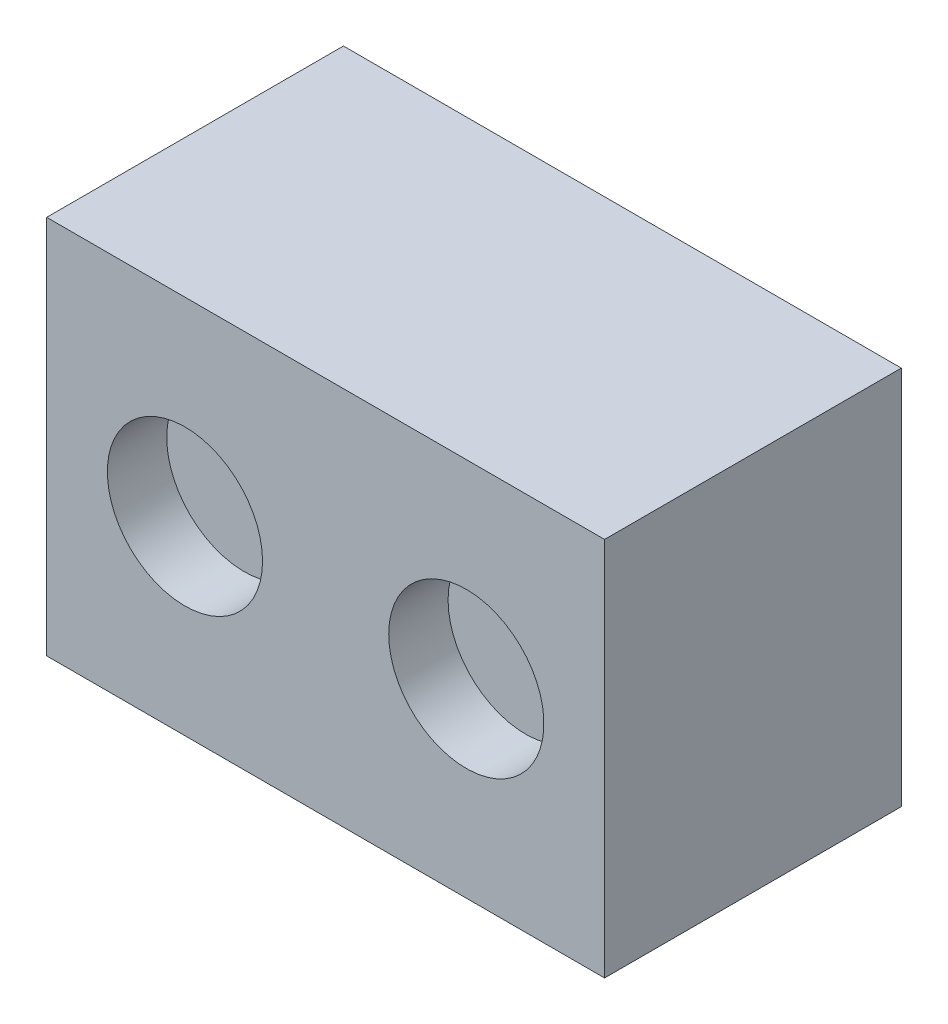
ISO-10303-21;
HEADER;
FILE_DESCRIPTION(('STEP AP214'),'2;1');
FILE_NAME('part.step','',(''),(''),'','','');
FILE_SCHEMA(('AUTOMOTIVE_DESIGN { 1 0 10303 214 1 1 1 1 }'));
ENDSEC;
DATA;
#1=APPLICATION_CONTEXT('core data for automotive mechanical design processes');
#2=APPLICATION_PROTOCOL_DEFINITION('international standard','automotive_design',2000,#1);
#3=PRODUCT_CONTEXT('',#1,'mechanical');
#4=PRODUCT('Part','Part','',(#3));
#5=PRODUCT_RELATED_PRODUCT_CATEGORY('part','',(#4));
#6=PRODUCT_DEFINITION_FORMATION('','',#4);
#7=PRODUCT_DEFINITION_CONTEXT('part definition',#1,'design');
#8=PRODUCT_DEFINITION('design','',#6,#7);
#9=PRODUCT_DEFINITION_SHAPE('','',#8);
#10=(LENGTH_UNIT() NAMED_UNIT(*) SI_UNIT(.MILLI.,.METRE.));
#11=(NAMED_UNIT(*) PLANE_ANGLE_UNIT() SI_UNIT($,.RADIAN.));
#12=(NAMED_UNIT(*) SI_UNIT($,.STERADIAN.) SOLID_ANGLE_UNIT());
#13=UNCERTAINTY_MEASURE_WITH_UNIT(LENGTH_MEASURE(1.E-05),#10,'distance_accuracy_value','');
#14=(GEOMETRIC_REPRESENTATION_CONTEXT(3) GLOBAL_UNCERTAINTY_ASSIGNED_CONTEXT((#13)) GLOBAL_UNIT_ASSIGNED_CONTEXT((#10,
#11,#12)) REPRESENTATION_CONTEXT('',''));
#15=CARTESIAN_POINT('',(0.,0.,0.));
#16=DIRECTION('',(0.,0.,1.));
#17=DIRECTION('',(1.,0.,0.));
#18=AXIS2_PLACEMENT_3D('',#15,#16,#17);
#19=CARTESIAN_POINT('',(9.4,6.4,10.));
#20=DIRECTION('',(-1.,0.,0.));
#21=DIRECTION('',(0.,0.,1.));
#22=AXIS2_PLACEMENT_3D('',#19,#20,#21);
#23=PLANE('',#22);
#24=DIRECTION('',(0.,1.,0.));
#25=VECTOR('',#24,1.);
#26=CARTESIAN_POINT('',(9.4,6.4,0.));
#27=LINE('',#26,#25);
#28=CARTESIAN_POINT('',(9.4,-6.4,0.));
#29=VERTEX_POINT('',#28);
#30=CARTESIAN_POINT('',(9.4,6.4,0.));
#31=VERTEX_POINT('',#30);
#32=EDGE_CURVE('E113',#29,#31,#27,.T.);
#33=ORIENTED_EDGE('',*,*,#32,.T.);
#34=DIRECTION('',(0.,0.,-1.));
#35=VECTOR('',#34,1.);
#36=CARTESIAN_POINT('',(9.4,6.4,10.));
#37=LINE('',#36,#35);
#38=CARTESIAN_POINT('',(9.4,6.4,10.));
#39=VERTEX_POINT('',#38);
#40=EDGE_CURVE('E11',#39,#31,#37,.T.);
#41=ORIENTED_EDGE('',*,*,#40,.F.);
#42=DIRECTION('',(0.,1.,0.));
#43=VECTOR('',#42,1.);
#44=CARTESIAN_POINT('',(9.4,6.4,10.));
#45=LINE('',#44,#43);
#46=CARTESIAN_POINT('',(9.4,-6.4,10.));
#47=VERTEX_POINT('',#46);
#48=EDGE_CURVE('E97',#47,#39,#45,.T.);
#49=ORIENTED_EDGE('',*,*,#48,.F.);
#50=DIRECTION('',(0.,0.,-1.));
#51=VECTOR('',#50,1.);
#52=CARTESIAN_POINT('',(9.4,-6.4,10.));
#53=LINE('',#52,#51);
#54=EDGE_CURVE('E109',#47,#29,#53,.T.);
#55=ORIENTED_EDGE('',*,*,#54,.T.);
#56=EDGE_LOOP('',(#33,#41,#49,#55));
#57=FACE_BOUND('',#56,.T.);
#58=ADVANCED_FACE('F45',(#57),#23,.F.);
#59=CARTESIAN_POINT('',(-9.4,6.4,10.));
#60=DIRECTION('',(0.,-1.,0.));
#61=DIRECTION('',(0.,0.,-1.));
#62=AXIS2_PLACEMENT_3D('',#59,#60,#61);
#63=PLANE('',#62);
#64=DIRECTION('',(-1.,0.,0.));
#65=VECTOR('',#64,1.);
#66=CARTESIAN_POINT('',(-9.4,6.4,0.));
#67=LINE('',#66,#65);
#68=CARTESIAN_POINT('',(-9.4,6.4,0.));
#69=VERTEX_POINT('',#68);
#70=EDGE_CURVE('E102',#31,#69,#67,.T.);
#71=ORIENTED_EDGE('',*,*,#70,.T.);
#72=DIRECTION('',(0.,0.,-1.));
#73=VECTOR('',#72,1.);
#74=CARTESIAN_POINT('',(-9.4,6.4,10.));
#75=LINE('',#74,#73);
#76=CARTESIAN_POINT('',(-9.4,6.4,10.));
#77=VERTEX_POINT('',#76);
#78=EDGE_CURVE('E54',#77,#69,#75,.T.);
#79=ORIENTED_EDGE('',*,*,#78,.F.);
#80=DIRECTION('',(-1.,0.,0.));
#81=VECTOR('',#80,1.);
#82=CARTESIAN_POINT('',(-9.4,6.4,10.));
#83=LINE('',#82,#81);
#84=EDGE_CURVE('E92',#39,#77,#83,.T.);
#85=ORIENTED_EDGE('',*,*,#84,.F.);
#86=ORIENTED_EDGE('',*,*,#40,.T.);
#87=EDGE_LOOP('',(#71,#79,#85,#86));
#88=FACE_BOUND('',#87,.T.);
#89=ADVANCED_FACE('F101',(#88),#63,.F.);
#90=CARTESIAN_POINT('',(-9.4,6.4,10.));
#91=DIRECTION('',(1.,0.,0.));
#92=DIRECTION('',(0.,0.,-1.));
#93=AXIS2_PLACEMENT_3D('',#90,#91,#92);
#94=PLANE('',#93);
#95=DIRECTION('',(0.,-1.,0.));
#96=VECTOR('',#95,1.);
#97=CARTESIAN_POINT('',(-9.4,6.4,0.));
#98=LINE('',#97,#96);
#99=CARTESIAN_POINT('',(-9.4,-6.4,0.));
#100=VERTEX_POINT('',#99);
#101=EDGE_CURVE('E79',#69,#100,#98,.T.);
#102=ORIENTED_EDGE('',*,*,#101,.T.);
#103=DIRECTION('',(0.,0.,-1.));
#104=VECTOR('',#103,1.);
#105=CARTESIAN_POINT('',(-9.4,-6.4,10.));
#106=LINE('',#105,#104);
#107=CARTESIAN_POINT('',(-9.4,-6.4,10.));
#108=VERTEX_POINT('',#107);
#109=EDGE_CURVE('E104',#108,#100,#106,.T.);
#110=ORIENTED_EDGE('',*,*,#109,.F.);
#111=DIRECTION('',(0.,-1.,0.));
#112=VECTOR('',#111,1.);
#113=CARTESIAN_POINT('',(-9.4,6.4,10.));
#114=LINE('',#113,#112);
#115=EDGE_CURVE('E95',#77,#108,#114,.T.);
#116=ORIENTED_EDGE('',*,*,#115,.F.);
#117=ORIENTED_EDGE('',*,*,#78,.T.);
#118=EDGE_LOOP('',(#102,#110,#116,#117));
#119=FACE_BOUND('',#118,.T.);
#120=ADVANCED_FACE('F105',(#119),#94,.F.);
#121=CARTESIAN_POINT('',(-9.4,-6.4,10.));
#122=DIRECTION('',(0.,1.,0.));
#123=DIRECTION('',(0.,0.,1.));
#124=AXIS2_PLACEMENT_3D('',#121,#122,#123);
#125=PLANE('',#124);
#126=DIRECTION('',(1.,0.,0.));
#127=VECTOR('',#126,1.);
#128=CARTESIAN_POINT('',(-9.4,-6.4,0.));
#129=LINE('',#128,#127);
#130=EDGE_CURVE('E85',#100,#29,#129,.T.);
#131=ORIENTED_EDGE('',*,*,#130,.T.);
#132=ORIENTED_EDGE('',*,*,#54,.F.);
#133=DIRECTION('',(1.,0.,0.));
#134=VECTOR('',#133,1.);
#135=CARTESIAN_POINT('',(-9.4,-6.4,10.));
#136=LINE('',#135,#134);
#137=EDGE_CURVE('E62',#108,#47,#136,.T.);
#138=ORIENTED_EDGE('',*,*,#137,.F.);
#139=ORIENTED_EDGE('',*,*,#109,.T.);
#140=EDGE_LOOP('',(#131,#132,#138,#139));
#141=FACE_BOUND('',#140,.T.);
#142=ADVANCED_FACE('F127',(#141),#125,.F.);
#143=CARTESIAN_POINT('',(0.,0.,10.));
#144=DIRECTION('',(0.,0.,1.));
#145=DIRECTION('',(1.,0.,0.));
#146=AXIS2_PLACEMENT_3D('',#143,#144,#145);
#147=PLANE('',#146);
#148=CARTESIAN_POINT('',(4.74066889936202,0.,10.));
#149=DIRECTION('',(0.,0.,-1.));
#150=DIRECTION('',(-1.,0.,0.));
#151=AXIS2_PLACEMENT_3D('',#148,#149,#150);
#152=CIRCLE('',#151,2.6146428966049);
#153=CARTESIAN_POINT('',(2.12602600275711,0.,10.));
#154=VERTEX_POINT('',#153);
#155=EDGE_CURVE('E142',#154,#154,#152,.T.);
#156=ORIENTED_EDGE('',*,*,#155,.T.);
#157=EDGE_LOOP('',(#156));
#158=FACE_BOUND('',#157,.T.);
#159=CARTESIAN_POINT('',(-4.74066889936202,0.,10.));
#160=DIRECTION('',(0.,0.,1.));
#161=DIRECTION('',(1.,0.,0.));
#162=AXIS2_PLACEMENT_3D('',#159,#160,#161);
#163=CIRCLE('',#162,2.6146428966049);
#164=CARTESIAN_POINT('',(-2.12602600275711,0.,10.));
#165=VERTEX_POINT('',#164);
#166=EDGE_CURVE('E134',#165,#165,#163,.T.);
#167=ORIENTED_EDGE('',*,*,#166,.F.);
#168=EDGE_LOOP('',(#167));
#169=FACE_BOUND('',#168,.T.);
#170=ORIENTED_EDGE('',*,*,#48,.T.);
#171=ORIENTED_EDGE('',*,*,#84,.T.);
#172=ORIENTED_EDGE('',*,*,#115,.T.);
#173=ORIENTED_EDGE('',*,*,#137,.T.);
#174=EDGE_LOOP('',(#170,#171,#172,#173));
#175=FACE_BOUND('',#174,.T.);
#176=ADVANCED_FACE('F93',(#158,#169,#175),#147,.T.);
#177=CARTESIAN_POINT('',(0.,0.,0.));
#178=DIRECTION('',(0.,0.,1.));
#179=DIRECTION('',(1.,0.,0.));
#180=AXIS2_PLACEMENT_3D('',#177,#178,#179);
#181=PLANE('',#180);
#182=ORIENTED_EDGE('',*,*,#32,.F.);
#183=ORIENTED_EDGE('',*,*,#130,.F.);
#184=ORIENTED_EDGE('',*,*,#101,.F.);
#185=ORIENTED_EDGE('',*,*,#70,.F.);
#186=EDGE_LOOP('',(#182,#183,#184,#185));
#187=FACE_BOUND('',#186,.T.);
#188=ADVANCED_FACE('F130',(#187),#181,.F.);
#189=CARTESIAN_POINT('',(-4.74066889936202,0.,8.));
#190=DIRECTION('',(0.,0.,1.));
#191=DIRECTION('',(1.,0.,0.));
#192=AXIS2_PLACEMENT_3D('',#189,#190,#191);
#193=CYLINDRICAL_SURFACE('',#192,2.6146428966049);
#194=CARTESIAN_POINT('',(-4.74066889936202,0.,8.));
#195=DIRECTION('',(0.,0.,1.));
#196=DIRECTION('',(1.,0.,0.));
#197=AXIS2_PLACEMENT_3D('',#194,#195,#196);
#198=CIRCLE('',#197,2.6146428966049);
#199=CARTESIAN_POINT('',(-2.12602600275711,0.,8.));
#200=VERTEX_POINT('',#199);
#201=EDGE_CURVE('E117',#200,#200,#198,.T.);
#202=ORIENTED_EDGE('',*,*,#201,.F.);
#203=EDGE_LOOP('',(#202));
#204=FACE_BOUND('',#203,.T.);
#205=ORIENTED_EDGE('',*,*,#166,.T.);
#206=EDGE_LOOP('',(#205));
#207=FACE_BOUND('',#206,.T.);
#208=ADVANCED_FACE('F174',(#204,#207),#193,.F.);
#209=CARTESIAN_POINT('',(-4.74066889936202,0.,8.));
#210=DIRECTION('',(0.,0.,1.));
#211=DIRECTION('',(1.,0.,0.));
#212=AXIS2_PLACEMENT_3D('',#209,#210,#211);
#213=PLANE('',#212);
#214=ORIENTED_EDGE('',*,*,#201,.T.);
#215=EDGE_LOOP('',(#214));
#216=FACE_BOUND('',#215,.T.);
#217=ADVANCED_FACE('F159',(#216),#213,.T.);
#218=CARTESIAN_POINT('',(4.74066889936202,0.,8.));
#219=DIRECTION('',(0.,0.,1.));
#220=DIRECTION('',(1.,0.,0.));
#221=AXIS2_PLACEMENT_3D('',#218,#219,#220);
#222=CYLINDRICAL_SURFACE('',#221,2.6146428966049);
#223=CARTESIAN_POINT('',(4.74066889936202,0.,8.));
#224=DIRECTION('',(0.,0.,-1.));
#225=DIRECTION('',(-1.,0.,0.));
#226=AXIS2_PLACEMENT_3D('',#223,#224,#225);
#227=CIRCLE('',#226,2.6146428966049);
#228=CARTESIAN_POINT('',(2.12602600275711,0.,8.));
#229=VERTEX_POINT('',#228);
#230=EDGE_CURVE('E138',#229,#229,#227,.T.);
#231=ORIENTED_EDGE('',*,*,#230,.T.);
#232=EDGE_LOOP('',(#231));
#233=FACE_BOUND('',#232,.T.);
#234=ORIENTED_EDGE('',*,*,#155,.F.);
#235=EDGE_LOOP('',(#234));
#236=FACE_BOUND('',#235,.T.);
#237=ADVANCED_FACE('F150',(#233,#236),#222,.F.);
#238=CARTESIAN_POINT('',(4.74066889936202,0.,8.));
#239=DIRECTION('',(0.,0.,1.));
#240=DIRECTION('',(-1.,0.,0.));
#241=AXIS2_PLACEMENT_3D('',#238,#239,#240);
#242=PLANE('',#241);
#243=ORIENTED_EDGE('',*,*,#230,.F.);
#244=EDGE_LOOP('',(#243));
#245=FACE_BOUND('',#244,.T.);
#246=ADVANCED_FACE('F153',(#245),#242,.T.);
#247=CLOSED_SHELL('',(#58,#89,#120,#142,#176,#188,#208,#217,#237,#246));
#248=MANIFOLD_SOLID_BREP('B2',#247);
#249=ADVANCED_BREP_SHAPE_REPRESENTATION('',(#18,#248),#14);
#250=SHAPE_DEFINITION_REPRESENTATION(#9,#249);
ENDSEC;
END-ISO-10303-21;
